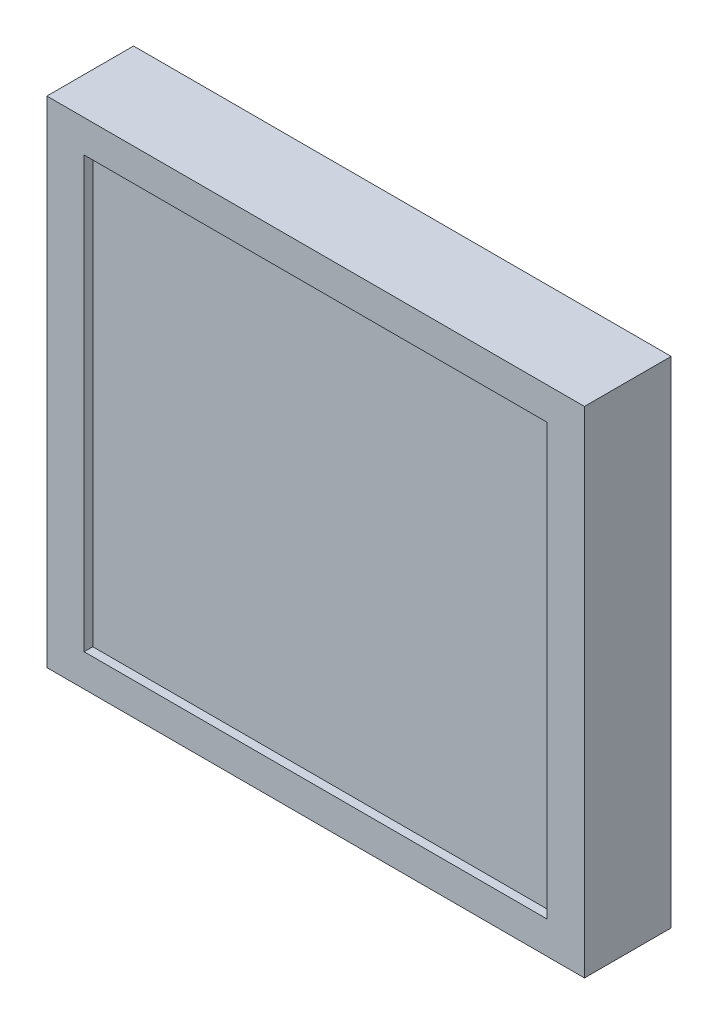
ISO-10303-21;
HEADER;
FILE_DESCRIPTION(('STEP AP214'),'2;1');
FILE_NAME('part.step','',(''),(''),'','','');
FILE_SCHEMA(('AUTOMOTIVE_DESIGN { 1 0 10303 214 1 1 1 1 }'));
ENDSEC;
DATA;
#1=APPLICATION_CONTEXT('core data for automotive mechanical design processes');
#2=APPLICATION_PROTOCOL_DEFINITION('international standard','automotive_design',2000,#1);
#3=PRODUCT_CONTEXT('',#1,'mechanical');
#4=PRODUCT('Part','Part','',(#3));
#5=PRODUCT_RELATED_PRODUCT_CATEGORY('part','',(#4));
#6=PRODUCT_DEFINITION_FORMATION('','',#4);
#7=PRODUCT_DEFINITION_CONTEXT('part definition',#1,'design');
#8=PRODUCT_DEFINITION('design','',#6,#7);
#9=PRODUCT_DEFINITION_SHAPE('','',#8);
#10=(LENGTH_UNIT() NAMED_UNIT(*) SI_UNIT(.MILLI.,.METRE.));
#11=(NAMED_UNIT(*) PLANE_ANGLE_UNIT() SI_UNIT($,.RADIAN.));
#12=(NAMED_UNIT(*) SI_UNIT($,.STERADIAN.) SOLID_ANGLE_UNIT());
#13=UNCERTAINTY_MEASURE_WITH_UNIT(LENGTH_MEASURE(1.E-05),#10,'distance_accuracy_value','');
#14=(GEOMETRIC_REPRESENTATION_CONTEXT(3) GLOBAL_UNCERTAINTY_ASSIGNED_CONTEXT((#13)) GLOBAL_UNIT_ASSIGNED_CONTEXT((#10,
#11,#12)) REPRESENTATION_CONTEXT('',''));
#15=CARTESIAN_POINT('',(0.,0.,0.));
#16=DIRECTION('',(0.,0.,1.));
#17=DIRECTION('',(1.,0.,0.));
#18=AXIS2_PLACEMENT_3D('',#15,#16,#17);
#19=CARTESIAN_POINT('',(6.20169450448091,-5.71031939323688,2.));
#20=DIRECTION('',(-1.,0.,0.));
#21=DIRECTION('',(0.,0.,1.));
#22=AXIS2_PLACEMENT_3D('',#19,#20,#21);
#23=PLANE('',#22);
#24=DIRECTION('',(0.,1.,0.));
#25=VECTOR('',#24,1.);
#26=CARTESIAN_POINT('',(6.20169450448091,-5.71031939323688,0.));
#27=LINE('',#26,#25);
#28=CARTESIAN_POINT('',(6.20169450448091,-5.71031939323688,0.));
#29=VERTEX_POINT('',#28);
#30=CARTESIAN_POINT('',(6.20169450448091,5.71031939323688,0.));
#31=VERTEX_POINT('',#30);
#32=EDGE_CURVE('E149',#29,#31,#27,.T.);
#33=ORIENTED_EDGE('',*,*,#32,.T.);
#34=DIRECTION('',(0.,0.,-1.));
#35=VECTOR('',#34,1.);
#36=CARTESIAN_POINT('',(6.20169450448091,5.71031939323688,2.));
#37=LINE('',#36,#35);
#38=CARTESIAN_POINT('',(6.20169450448091,5.71031939323688,2.));
#39=VERTEX_POINT('',#38);
#40=EDGE_CURVE('E11',#39,#31,#37,.T.);
#41=ORIENTED_EDGE('',*,*,#40,.F.);
#42=DIRECTION('',(0.,1.,0.));
#43=VECTOR('',#42,1.);
#44=CARTESIAN_POINT('',(6.20169450448091,-5.71031939323688,2.));
#45=LINE('',#44,#43);
#46=CARTESIAN_POINT('',(6.20169450448091,-5.71031939323688,2.));
#47=VERTEX_POINT('',#46);
#48=EDGE_CURVE('E153',#47,#39,#45,.T.);
#49=ORIENTED_EDGE('',*,*,#48,.F.);
#50=DIRECTION('',(0.,0.,-1.));
#51=VECTOR('',#50,1.);
#52=CARTESIAN_POINT('',(6.20169450448091,-5.71031939323688,2.));
#53=LINE('',#52,#51);
#54=EDGE_CURVE('E159',#47,#29,#53,.T.);
#55=ORIENTED_EDGE('',*,*,#54,.T.);
#56=EDGE_LOOP('',(#33,#41,#49,#55));
#57=FACE_BOUND('',#56,.T.);
#58=ADVANCED_FACE('F41',(#57),#23,.F.);
#59=CARTESIAN_POINT('',(-6.20169450448091,5.71031939323688,2.));
#60=DIRECTION('',(0.,-1.,0.));
#61=DIRECTION('',(0.,0.,-1.));
#62=AXIS2_PLACEMENT_3D('',#59,#60,#61);
#63=PLANE('',#62);
#64=DIRECTION('',(-1.,0.,0.));
#65=VECTOR('',#64,1.);
#66=CARTESIAN_POINT('',(-6.20169450448091,5.71031939323688,0.));
#67=LINE('',#66,#65);
#68=CARTESIAN_POINT('',(-6.20169450448091,5.71031939323688,0.));
#69=VERTEX_POINT('',#68);
#70=EDGE_CURVE('E162',#31,#69,#67,.T.);
#71=ORIENTED_EDGE('',*,*,#70,.T.);
#72=DIRECTION('',(0.,0.,-1.));
#73=VECTOR('',#72,1.);
#74=CARTESIAN_POINT('',(-6.20169450448091,5.71031939323688,2.));
#75=LINE('',#74,#73);
#76=CARTESIAN_POINT('',(-6.20169450448091,5.71031939323688,2.));
#77=VERTEX_POINT('',#76);
#78=EDGE_CURVE('E48',#77,#69,#75,.T.);
#79=ORIENTED_EDGE('',*,*,#78,.F.);
#80=DIRECTION('',(-1.,0.,0.));
#81=VECTOR('',#80,1.);
#82=CARTESIAN_POINT('',(-6.20169450448091,5.71031939323688,2.));
#83=LINE('',#82,#81);
#84=EDGE_CURVE('E92',#39,#77,#83,.T.);
#85=ORIENTED_EDGE('',*,*,#84,.F.);
#86=ORIENTED_EDGE('',*,*,#40,.T.);
#87=EDGE_LOOP('',(#71,#79,#85,#86));
#88=FACE_BOUND('',#87,.T.);
#89=ADVANCED_FACE('F192',(#88),#63,.F.);
#90=CARTESIAN_POINT('',(-6.20169450448091,-5.71031939323688,2.));
#91=DIRECTION('',(1.,0.,0.));
#92=DIRECTION('',(0.,0.,-1.));
#93=AXIS2_PLACEMENT_3D('',#90,#91,#92);
#94=PLANE('',#93);
#95=DIRECTION('',(0.,-1.,0.));
#96=VECTOR('',#95,1.);
#97=CARTESIAN_POINT('',(-6.20169450448091,-5.71031939323688,0.));
#98=LINE('',#97,#96);
#99=CARTESIAN_POINT('',(-6.20169450448091,-5.71031939323688,0.));
#100=VERTEX_POINT('',#99);
#101=EDGE_CURVE('E164',#69,#100,#98,.T.);
#102=ORIENTED_EDGE('',*,*,#101,.T.);
#103=DIRECTION('',(0.,0.,-1.));
#104=VECTOR('',#103,1.);
#105=CARTESIAN_POINT('',(-6.20169450448091,-5.71031939323688,2.));
#106=LINE('',#105,#104);
#107=CARTESIAN_POINT('',(-6.20169450448091,-5.71031939323688,2.));
#108=VERTEX_POINT('',#107);
#109=EDGE_CURVE('E168',#108,#100,#106,.T.);
#110=ORIENTED_EDGE('',*,*,#109,.F.);
#111=DIRECTION('',(0.,-1.,0.));
#112=VECTOR('',#111,1.);
#113=CARTESIAN_POINT('',(-6.20169450448091,-5.71031939323688,2.));
#114=LINE('',#113,#112);
#115=EDGE_CURVE('E156',#77,#108,#114,.T.);
#116=ORIENTED_EDGE('',*,*,#115,.F.);
#117=ORIENTED_EDGE('',*,*,#78,.T.);
#118=EDGE_LOOP('',(#102,#110,#116,#117));
#119=FACE_BOUND('',#118,.T.);
#120=ADVANCED_FACE('F173',(#119),#94,.F.);
#121=CARTESIAN_POINT('',(-6.20169450448091,-5.71031939323688,2.));
#122=DIRECTION('',(0.,1.,0.));
#123=DIRECTION('',(0.,0.,1.));
#124=AXIS2_PLACEMENT_3D('',#121,#122,#123);
#125=PLANE('',#124);
#126=DIRECTION('',(1.,0.,0.));
#127=VECTOR('',#126,1.);
#128=CARTESIAN_POINT('',(-6.20169450448091,-5.71031939323688,0.));
#129=LINE('',#128,#127);
#130=EDGE_CURVE('E85',#100,#29,#129,.T.);
#131=ORIENTED_EDGE('',*,*,#130,.T.);
#132=ORIENTED_EDGE('',*,*,#54,.F.);
#133=DIRECTION('',(1.,0.,0.));
#134=VECTOR('',#133,1.);
#135=CARTESIAN_POINT('',(-6.20169450448091,-5.71031939323688,2.));
#136=LINE('',#135,#134);
#137=EDGE_CURVE('E64',#108,#47,#136,.T.);
#138=ORIENTED_EDGE('',*,*,#137,.F.);
#139=ORIENTED_EDGE('',*,*,#109,.T.);
#140=EDGE_LOOP('',(#131,#132,#138,#139));
#141=FACE_BOUND('',#140,.T.);
#142=ADVANCED_FACE('F181',(#141),#125,.F.);
#143=CARTESIAN_POINT('',(0.,0.,2.));
#144=DIRECTION('',(0.,0.,-1.));
#145=DIRECTION('',(-1.,0.,0.));
#146=AXIS2_PLACEMENT_3D('',#143,#144,#145);
#147=PLANE('',#146);
#148=DIRECTION('',(-1.,0.,0.));
#149=VECTOR('',#148,1.);
#150=CARTESIAN_POINT('',(-5.34181468728536,4.96314162344189,2.));
#151=LINE('',#150,#149);
#152=CARTESIAN_POINT('',(5.34181468728536,4.96314162344189,2.));
#153=VERTEX_POINT('',#152);
#154=CARTESIAN_POINT('',(-5.34181468728536,4.96314162344189,2.));
#155=VERTEX_POINT('',#154);
#156=EDGE_CURVE('E143',#153,#155,#151,.T.);
#157=ORIENTED_EDGE('',*,*,#156,.F.);
#158=DIRECTION('',(0.,1.,0.));
#159=VECTOR('',#158,1.);
#160=CARTESIAN_POINT('',(5.34181468728536,-4.96314162344189,2.));
#161=LINE('',#160,#159);
#162=CARTESIAN_POINT('',(5.34181468728536,-4.96314162344189,2.));
#163=VERTEX_POINT('',#162);
#164=EDGE_CURVE('E55',#163,#153,#161,.T.);
#165=ORIENTED_EDGE('',*,*,#164,.F.);
#166=DIRECTION('',(1.,0.,0.));
#167=VECTOR('',#166,1.);
#168=CARTESIAN_POINT('',(-5.34181468728536,-4.96314162344189,2.));
#169=LINE('',#168,#167);
#170=CARTESIAN_POINT('',(-5.34181468728536,-4.96314162344189,2.));
#171=VERTEX_POINT('',#170);
#172=EDGE_CURVE('E134',#171,#163,#169,.T.);
#173=ORIENTED_EDGE('',*,*,#172,.F.);
#174=DIRECTION('',(0.,-1.,0.));
#175=VECTOR('',#174,1.);
#176=CARTESIAN_POINT('',(-5.34181468728536,-4.96314162344189,2.));
#177=LINE('',#176,#175);
#178=EDGE_CURVE('E137',#155,#171,#177,.T.);
#179=ORIENTED_EDGE('',*,*,#178,.F.);
#180=EDGE_LOOP('',(#157,#165,#173,#179));
#181=FACE_BOUND('',#180,.T.);
#182=ORIENTED_EDGE('',*,*,#48,.T.);
#183=ORIENTED_EDGE('',*,*,#84,.T.);
#184=ORIENTED_EDGE('',*,*,#115,.T.);
#185=ORIENTED_EDGE('',*,*,#137,.T.);
#186=EDGE_LOOP('',(#182,#183,#184,#185));
#187=FACE_BOUND('',#186,.T.);
#188=ADVANCED_FACE('F183',(#181,#187),#147,.F.);
#189=CARTESIAN_POINT('',(0.,0.,0.));
#190=DIRECTION('',(0.,0.,-1.));
#191=DIRECTION('',(-1.,0.,0.));
#192=AXIS2_PLACEMENT_3D('',#189,#190,#191);
#193=PLANE('',#192);
#194=ORIENTED_EDGE('',*,*,#32,.F.);
#195=ORIENTED_EDGE('',*,*,#130,.F.);
#196=ORIENTED_EDGE('',*,*,#101,.F.);
#197=ORIENTED_EDGE('',*,*,#70,.F.);
#198=EDGE_LOOP('',(#194,#195,#196,#197));
#199=FACE_BOUND('',#198,.T.);
#200=ADVANCED_FACE('F177',(#199),#193,.T.);
#201=CARTESIAN_POINT('',(5.34181468728536,-4.96314162344189,1.8));
#202=DIRECTION('',(1.,0.,0.));
#203=DIRECTION('',(0.,0.,-1.));
#204=AXIS2_PLACEMENT_3D('',#201,#202,#203);
#205=PLANE('',#204);
#206=ORIENTED_EDGE('',*,*,#164,.T.);
#207=DIRECTION('',(0.,0.,1.));
#208=VECTOR('',#207,1.);
#209=CARTESIAN_POINT('',(5.34181468728536,4.96314162344189,1.8));
#210=LINE('',#209,#208);
#211=CARTESIAN_POINT('',(5.34181468728536,4.96314162344189,1.8));
#212=VERTEX_POINT('',#211);
#213=EDGE_CURVE('E112',#212,#153,#210,.T.);
#214=ORIENTED_EDGE('',*,*,#213,.F.);
#215=DIRECTION('',(0.,1.,0.));
#216=VECTOR('',#215,1.);
#217=CARTESIAN_POINT('',(5.34181468728536,-4.96314162344189,1.8));
#218=LINE('',#217,#216);
#219=CARTESIAN_POINT('',(5.34181468728536,-4.96314162344189,1.8));
#220=VERTEX_POINT('',#219);
#221=EDGE_CURVE('E116',#220,#212,#218,.T.);
#222=ORIENTED_EDGE('',*,*,#221,.F.);
#223=DIRECTION('',(0.,0.,1.));
#224=VECTOR('',#223,1.);
#225=CARTESIAN_POINT('',(5.34181468728536,-4.96314162344189,1.8));
#226=LINE('',#225,#224);
#227=EDGE_CURVE('E147',#220,#163,#226,.T.);
#228=ORIENTED_EDGE('',*,*,#227,.T.);
#229=EDGE_LOOP('',(#206,#214,#222,#228));
#230=FACE_BOUND('',#229,.T.);
#231=ADVANCED_FACE('F114',(#230),#205,.F.);
#232=CARTESIAN_POINT('',(-5.34181468728536,-4.96314162344189,1.8));
#233=DIRECTION('',(0.,-1.,0.));
#234=DIRECTION('',(0.,0.,-1.));
#235=AXIS2_PLACEMENT_3D('',#232,#233,#234);
#236=PLANE('',#235);
#237=ORIENTED_EDGE('',*,*,#172,.T.);
#238=ORIENTED_EDGE('',*,*,#227,.F.);
#239=DIRECTION('',(1.,0.,0.));
#240=VECTOR('',#239,1.);
#241=CARTESIAN_POINT('',(-5.34181468728536,-4.96314162344189,1.8));
#242=LINE('',#241,#240);
#243=CARTESIAN_POINT('',(-5.34181468728536,-4.96314162344189,1.8));
#244=VERTEX_POINT('',#243);
#245=EDGE_CURVE('E122',#244,#220,#242,.T.);
#246=ORIENTED_EDGE('',*,*,#245,.F.);
#247=DIRECTION('',(0.,0.,1.));
#248=VECTOR('',#247,1.);
#249=CARTESIAN_POINT('',(-5.34181468728536,-4.96314162344189,1.8));
#250=LINE('',#249,#248);
#251=EDGE_CURVE('E150',#244,#171,#250,.T.);
#252=ORIENTED_EDGE('',*,*,#251,.T.);
#253=EDGE_LOOP('',(#237,#238,#246,#252));
#254=FACE_BOUND('',#253,.T.);
#255=ADVANCED_FACE('F232',(#254),#236,.F.);
#256=CARTESIAN_POINT('',(-5.34181468728536,-4.96314162344189,1.8));
#257=DIRECTION('',(-1.,0.,0.));
#258=DIRECTION('',(0.,0.,1.));
#259=AXIS2_PLACEMENT_3D('',#256,#257,#258);
#260=PLANE('',#259);
#261=ORIENTED_EDGE('',*,*,#178,.T.);
#262=ORIENTED_EDGE('',*,*,#251,.F.);
#263=DIRECTION('',(0.,-1.,0.));
#264=VECTOR('',#263,1.);
#265=CARTESIAN_POINT('',(-5.34181468728536,-4.96314162344189,1.8));
#266=LINE('',#265,#264);
#267=CARTESIAN_POINT('',(-5.34181468728536,4.96314162344189,1.8));
#268=VERTEX_POINT('',#267);
#269=EDGE_CURVE('E130',#268,#244,#266,.T.);
#270=ORIENTED_EDGE('',*,*,#269,.F.);
#271=DIRECTION('',(0.,0.,1.));
#272=VECTOR('',#271,1.);
#273=CARTESIAN_POINT('',(-5.34181468728536,4.96314162344189,1.8));
#274=LINE('',#273,#272);
#275=EDGE_CURVE('E121',#268,#155,#274,.T.);
#276=ORIENTED_EDGE('',*,*,#275,.T.);
#277=EDGE_LOOP('',(#261,#262,#270,#276));
#278=FACE_BOUND('',#277,.T.);
#279=ADVANCED_FACE('F241',(#278),#260,.F.);
#280=CARTESIAN_POINT('',(-5.34181468728536,4.96314162344189,1.8));
#281=DIRECTION('',(0.,1.,0.));
#282=DIRECTION('',(0.,0.,1.));
#283=AXIS2_PLACEMENT_3D('',#280,#281,#282);
#284=PLANE('',#283);
#285=ORIENTED_EDGE('',*,*,#156,.T.);
#286=ORIENTED_EDGE('',*,*,#275,.F.);
#287=DIRECTION('',(-1.,0.,0.));
#288=VECTOR('',#287,1.);
#289=CARTESIAN_POINT('',(-5.34181468728536,4.96314162344189,1.8));
#290=LINE('',#289,#288);
#291=EDGE_CURVE('E125',#212,#268,#290,.T.);
#292=ORIENTED_EDGE('',*,*,#291,.F.);
#293=ORIENTED_EDGE('',*,*,#213,.T.);
#294=EDGE_LOOP('',(#285,#286,#292,#293));
#295=FACE_BOUND('',#294,.T.);
#296=ADVANCED_FACE('F126',(#295),#284,.F.);
#297=CARTESIAN_POINT('',(0.,0.,1.8));
#298=DIRECTION('',(0.,0.,-1.));
#299=DIRECTION('',(-1.,0.,0.));
#300=AXIS2_PLACEMENT_3D('',#297,#298,#299);
#301=PLANE('',#300);
#302=ORIENTED_EDGE('',*,*,#221,.T.);
#303=ORIENTED_EDGE('',*,*,#291,.T.);
#304=ORIENTED_EDGE('',*,*,#269,.T.);
#305=ORIENTED_EDGE('',*,*,#245,.T.);
#306=EDGE_LOOP('',(#302,#303,#304,#305));
#307=FACE_BOUND('',#306,.T.);
#308=ADVANCED_FACE('F132',(#307),#301,.F.);
#309=CLOSED_SHELL('',(#58,#89,#120,#142,#188,#200,#231,#255,#279,#296,#308));
#310=MANIFOLD_SOLID_BREP('B2',#309);
#311=ADVANCED_BREP_SHAPE_REPRESENTATION('',(#18,#310),#14);
#312=SHAPE_DEFINITION_REPRESENTATION(#9,#311);
ENDSEC;
END-ISO-10303-21;
